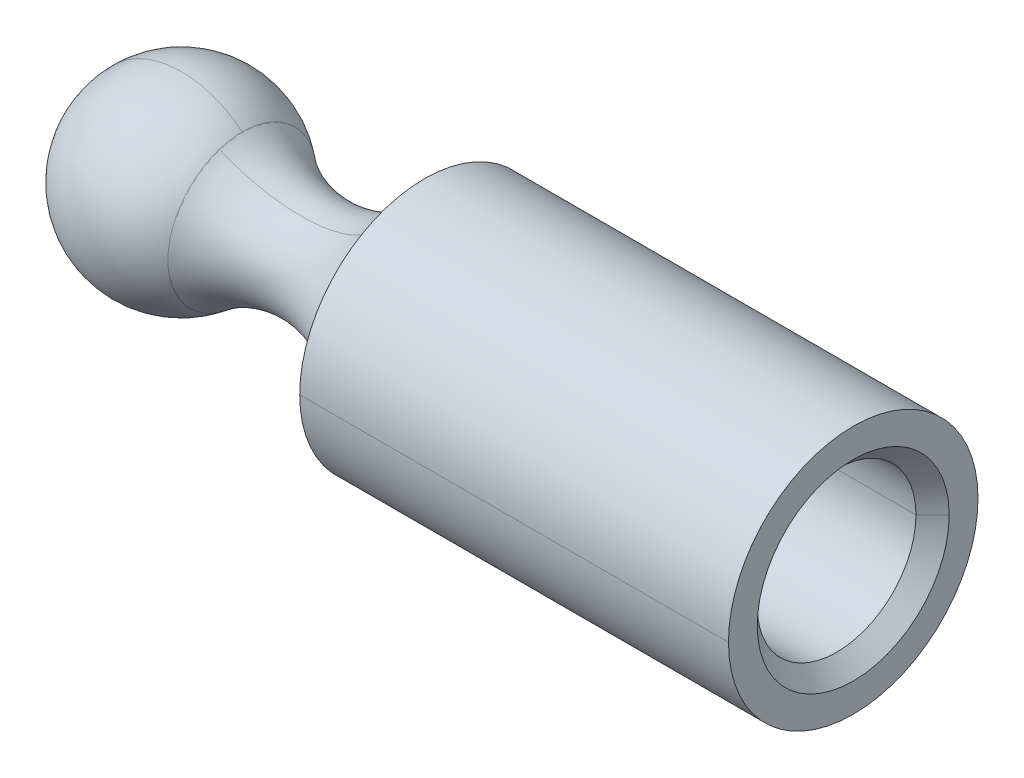
ISO-10303-21;
HEADER;
FILE_DESCRIPTION(('STEP AP214'),'2;1');
FILE_NAME('part.step','',(''),(''),'','','');
FILE_SCHEMA(('AUTOMOTIVE_DESIGN { 1 0 10303 214 1 1 1 1 }'));
ENDSEC;
DATA;
#1=APPLICATION_CONTEXT('core data for automotive mechanical design processes');
#2=APPLICATION_PROTOCOL_DEFINITION('international standard','automotive_design',2000,#1);
#3=PRODUCT_CONTEXT('',#1,'mechanical');
#4=PRODUCT('Part','Part','',(#3));
#5=PRODUCT_RELATED_PRODUCT_CATEGORY('part','',(#4));
#6=PRODUCT_DEFINITION_FORMATION('','',#4);
#7=PRODUCT_DEFINITION_CONTEXT('part definition',#1,'design');
#8=PRODUCT_DEFINITION('design','',#6,#7);
#9=PRODUCT_DEFINITION_SHAPE('','',#8);
#10=(LENGTH_UNIT() NAMED_UNIT(*) SI_UNIT(.MILLI.,.METRE.));
#11=(NAMED_UNIT(*) PLANE_ANGLE_UNIT() SI_UNIT($,.RADIAN.));
#12=(NAMED_UNIT(*) SI_UNIT($,.STERADIAN.) SOLID_ANGLE_UNIT());
#13=UNCERTAINTY_MEASURE_WITH_UNIT(LENGTH_MEASURE(1.E-05),#10,'distance_accuracy_value','');
#14=(GEOMETRIC_REPRESENTATION_CONTEXT(3) GLOBAL_UNCERTAINTY_ASSIGNED_CONTEXT((#13)) GLOBAL_UNIT_ASSIGNED_CONTEXT((#10,
#11,#12)) REPRESENTATION_CONTEXT('',''));
#15=CARTESIAN_POINT('',(0.,0.,0.));
#16=DIRECTION('',(0.,0.,1.));
#17=DIRECTION('',(1.,0.,0.));
#18=AXIS2_PLACEMENT_3D('',#15,#16,#17);
#19=CARTESIAN_POINT('',(-17.5,0.,0.));
#20=DIRECTION('',(1.,0.,0.));
#21=DIRECTION('',(0.,0.,1.));
#22=AXIS2_PLACEMENT_3D('',#19,#20,#21);
#23=SPHERICAL_SURFACE('',#22,2.50000000000007);
#24=CARTESIAN_POINT('',(-17.5,0.,0.));
#25=DIRECTION('',(0.,0.,1.));
#26=DIRECTION('',(0.638971066378369,0.769230769230723,0.));
#27=AXIS2_PLACEMENT_3D('',#24,#25,#26);
#28=CIRCLE('',#27,2.50000000000007);
#29=CARTESIAN_POINT('',(-15.902572334054,1.92307692307686,0.));
#30=VERTEX_POINT('',#29);
#31=CARTESIAN_POINT('',(-20.0000000000001,0.,0.));
#32=VERTEX_POINT('',#31);
#33=EDGE_CURVE('E11',#30,#32,#28,.T.);
#34=ORIENTED_EDGE('',*,*,#33,.F.);
#35=CARTESIAN_POINT('',(-15.902572334054,0.,0.));
#36=DIRECTION('',(1.,0.,0.));
#37=DIRECTION('',(0.,0.,-1.));
#38=AXIS2_PLACEMENT_3D('',#35,#36,#37);
#39=CIRCLE('',#38,1.9230769230769);
#40=CARTESIAN_POINT('',(-15.902572334054,0.,-1.9230769230769));
#41=VERTEX_POINT('',#40);
#42=EDGE_CURVE('E26',#41,#30,#39,.T.);
#43=ORIENTED_EDGE('',*,*,#42,.F.);
#44=CARTESIAN_POINT('',(-15.902572334054,0.,0.));
#45=DIRECTION('',(1.,0.,0.));
#46=DIRECTION('',(0.,-1.,0.));
#47=AXIS2_PLACEMENT_3D('',#44,#45,#46);
#48=CIRCLE('',#47,1.9230769230769);
#49=CARTESIAN_POINT('',(-15.902572334054,-1.92307692307686,0.));
#50=VERTEX_POINT('',#49);
#51=EDGE_CURVE('E339',#50,#41,#48,.T.);
#52=ORIENTED_EDGE('',*,*,#51,.F.);
#53=CARTESIAN_POINT('',(-17.5,0.,0.));
#54=DIRECTION('',(0.,0.,-1.));
#55=DIRECTION('',(0.638971066378369,-0.769230769230723,0.));
#56=AXIS2_PLACEMENT_3D('',#53,#54,#55);
#57=CIRCLE('',#56,2.50000000000007);
#58=EDGE_CURVE('E322',#50,#32,#57,.T.);
#59=ORIENTED_EDGE('',*,*,#58,.T.);
#60=EDGE_LOOP('',(#34,#43,#52,#59));
#61=FACE_BOUND('',#60,.T.);
#62=ADVANCED_FACE('F17',(#61),#23,.T.);
#63=CARTESIAN_POINT('',(-17.5,0.,0.));
#64=DIRECTION('',(1.,0.,0.));
#65=DIRECTION('',(0.,0.,-1.));
#66=AXIS2_PLACEMENT_3D('',#63,#64,#65);
#67=SPHERICAL_SURFACE('',#66,2.50000000000007);
#68=ORIENTED_EDGE('',*,*,#58,.F.);
#69=CARTESIAN_POINT('',(-15.902572334054,0.,0.));
#70=DIRECTION('',(1.,0.,0.));
#71=DIRECTION('',(0.,0.,-1.));
#72=AXIS2_PLACEMENT_3D('',#69,#70,#71);
#73=CIRCLE('',#72,1.9230769230769);
#74=CARTESIAN_POINT('',(-15.902572334054,0.,1.9230769230769));
#75=VERTEX_POINT('',#74);
#76=EDGE_CURVE('E321',#75,#50,#73,.T.);
#77=ORIENTED_EDGE('',*,*,#76,.F.);
#78=CARTESIAN_POINT('',(-15.902572334054,0.,0.));
#79=DIRECTION('',(1.,0.,0.));
#80=DIRECTION('',(0.,1.,0.));
#81=AXIS2_PLACEMENT_3D('',#78,#79,#80);
#82=CIRCLE('',#81,1.9230769230769);
#83=EDGE_CURVE('E317',#30,#75,#82,.T.);
#84=ORIENTED_EDGE('',*,*,#83,.F.);
#85=ORIENTED_EDGE('',*,*,#33,.T.);
#86=EDGE_LOOP('',(#68,#77,#84,#85));
#87=FACE_BOUND('',#86,.T.);
#88=ADVANCED_FACE('F283',(#87),#67,.T.);
#89=CARTESIAN_POINT('',(-15.902572334054,0.,0.));
#90=DIRECTION('',(-1.,0.,0.));
#91=DIRECTION('',(0.,-1.,0.));
#92=AXIS2_PLACEMENT_3D('',#89,#90,#91);
#93=CONICAL_SURFACE('',#92,1.9230769230769,0.693159907569802);
#94=DIRECTION('',(-0.769230769235187,0.,-0.638971066372995));
#95=VECTOR('',#94,1.);
#96=CARTESIAN_POINT('',(-15.902572334054,0.,-1.9230769230769));
#97=LINE('',#96,#95);
#98=CARTESIAN_POINT('',(-15.916913199135,0.,-1.9349893402864));
#99=VERTEX_POINT('',#98);
#100=EDGE_CURVE('E306',#41,#99,#97,.T.);
#101=ORIENTED_EDGE('',*,*,#100,.F.);
#102=ORIENTED_EDGE('',*,*,#42,.T.);
#103=ORIENTED_EDGE('',*,*,#83,.T.);
#104=DIRECTION('',(-0.769230769235187,0.,0.638971066372995));
#105=VECTOR('',#104,1.);
#106=CARTESIAN_POINT('',(-15.902572334054,0.,1.9230769230769));
#107=LINE('',#106,#105);
#108=CARTESIAN_POINT('',(-15.916913199135,0.,1.9349893402864));
#109=VERTEX_POINT('',#108);
#110=EDGE_CURVE('E191',#75,#109,#107,.T.);
#111=ORIENTED_EDGE('',*,*,#110,.T.);
#112=CARTESIAN_POINT('',(-15.916913199135,1.84028422104102,0.597944590082857));
#113=CARTESIAN_POINT('',(-15.916913199135,1.83245740316423,0.622033949215891));
#114=CARTESIAN_POINT('',(-15.916913199135,1.82415708534155,0.645969439197646));
#115=CARTESIAN_POINT('',(-15.916913199135,1.80662338297653,0.693496192674832));
#116=CARTESIAN_POINT('',(-15.916913199135,1.79738999843419,0.717087456170262));
#117=CARTESIAN_POINT('',(-15.916913199135,1.778004095802,0.763889268491037));
#118=CARTESIAN_POINT('',(-15.916913199135,1.76785157771215,0.78709981731638));
#119=CARTESIAN_POINT('',(-15.916913199135,1.74664314389858,0.833104441367647));
#120=CARTESIAN_POINT('',(-15.916913199135,1.73558722817487,0.855898516593572));
#121=CARTESIAN_POINT('',(-15.916913199135,1.71258902468535,0.90103503858104));
#122=CARTESIAN_POINT('',(-15.916913199135,1.70064673691954,0.923377485342582));
#123=CARTESIAN_POINT('',(-15.916913199135,1.67589420933703,0.967576302125619));
#124=CARTESIAN_POINT('',(-15.916913199135,1.66308396952033,0.989432672147112));
#125=CARTESIAN_POINT('',(-15.916913199135,1.63661528873006,1.03262563393347));
#126=CARTESIAN_POINT('',(-15.916913199135,1.62295684775649,1.05396222569833));
#127=CARTESIAN_POINT('',(-15.916913199135,1.59481282539845,1.09608273164836));
#128=CARTESIAN_POINT('',(-15.916913199135,1.58032724401397,1.11686664583352));
#129=CARTESIAN_POINT('',(-15.916913199135,1.55055127643812,1.15784974929342));
#130=CARTESIAN_POINT('',(-15.916913199135,1.53526089024676,1.17804893856815));
#131=CARTESIAN_POINT('',(-15.916913199135,1.50389888975455,1.21783144653249));
#132=CARTESIAN_POINT('',(-15.916913199135,1.48782727545369,1.23741476522211));
#133=CARTESIAN_POINT('',(-15.916913199135,1.45492759999877,1.27593533595527));
#134=CARTESIAN_POINT('',(-15.916913199135,1.4380995388447,1.29487258799881));
#135=CARTESIAN_POINT('',(-15.916913199135,1.40371291733609,1.33207182557056));
#136=CARTESIAN_POINT('',(-15.916913199135,1.38615435698155,1.35033381109876));
#137=CARTESIAN_POINT('',(-15.916913199135,1.35033381109881,1.38615435698159));
#138=CARTESIAN_POINT('',(-15.916913199135,1.33207182557062,1.40371291733622));
#139=CARTESIAN_POINT('',(-15.916913199135,1.29487258799876,1.43809953884456));
#140=CARTESIAN_POINT('',(-15.916913199135,1.27593533595509,1.45492759999827));
#141=CARTESIAN_POINT('',(-15.916913199135,1.2374147652223,1.48782727545418));
#142=CARTESIAN_POINT('',(-15.916913199135,1.21783144653318,1.50389888975638));
#143=CARTESIAN_POINT('',(-15.916913199135,1.17804893856747,1.53526089024492));
#144=CARTESIAN_POINT('',(-15.916913199135,1.15784974929089,1.55055127643125));
#145=CARTESIAN_POINT('',(-15.916913199135,1.11686664583606,1.58032724402083));
#146=CARTESIAN_POINT('',(-15.916913199135,1.09608273165782,1.59481282542407));
#147=CARTESIAN_POINT('',(-15.916913199135,1.05396222568888,1.62295684773087));
#148=CARTESIAN_POINT('',(-15.916913199135,1.03262563389819,1.63661528863442));
#149=CARTESIAN_POINT('',(-15.916913199135,0.989432672182397,1.66308396961595));
#150=CARTESIAN_POINT('',(-15.916913199135,0.967576302257293,1.67589420969393));
#151=CARTESIAN_POINT('',(-15.916913199135,0.923377485210917,1.70064673656264));
#152=CARTESIAN_POINT('',(-15.916913199135,0.901035038089645,1.71258902335338));
#153=CARTESIAN_POINT('',(-15.916913199135,0.855898517084975,1.73558722950682));
#154=CARTESIAN_POINT('',(-15.916913199135,0.833104443201577,1.74664314886953));
#155=CARTESIAN_POINT('',(-15.916913199135,0.787099815482459,1.7678515727412));
#156=CARTESIAN_POINT('',(-15.916913199135,0.76388926164674,1.77800407725018));
#157=CARTESIAN_POINT('',(-15.916913199135,0.717087463014569,1.79739001698601));
#158=CARTESIAN_POINT('',(-15.916913199135,0.693496218218118,1.80662345221287));
#159=CARTESIAN_POINT('',(-15.916913199135,0.64596941365437,1.8241570161052));
#160=CARTESIAN_POINT('',(-15.916913199135,0.622033853887073,1.83245714477068));
#161=CARTESIAN_POINT('',(-15.916913199135,0.573855326278651,1.84811129731135));
#162=CARTESIAN_POINT('',(-15.916913199135,0.549612358437525,1.85546532118653));
#163=CARTESIAN_POINT('',(-15.916913199135,0.500856395585398,1.86921592489468));
#164=CARTESIAN_POINT('',(-15.916913199135,0.476343400574396,1.87561250472764));
#165=CARTESIAN_POINT('',(-15.916913199135,0.427085180626515,1.88743835684159));
#166=CARTESIAN_POINT('',(-15.916913199135,0.402339955689636,1.89286762912258));
#167=CARTESIAN_POINT('',(-15.916913199135,0.352655431298864,1.90275049625748));
#168=CARTESIAN_POINT('',(-15.916913199135,0.327716131844971,1.90720409111139));
#169=CARTESIAN_POINT('',(-15.916913199135,0.277681912767536,1.91512873004207));
#170=CARTESIAN_POINT('',(-15.916913199135,0.252586993143992,1.91859977411885));
#171=CARTESIAN_POINT('',(-15.916913199135,0.202280229187856,1.92455398264599));
#172=CARTESIAN_POINT('',(-15.916913199135,0.177068384855263,1.92703714709635));
#173=CARTESIAN_POINT('',(-15.916913199135,0.126566642908524,1.93101168074429));
#174=CARTESIAN_POINT('',(-15.916913199135,0.101276745294377,1.93250304994187));
#175=CARTESIAN_POINT('',(-15.916913199135,0.0506579046964438,1.93449201731898));
#176=CARTESIAN_POINT('',(-15.916913199135,0.0253289617126568,1.93498961549851));
#177=CARTESIAN_POINT('',(-15.916913199135,0.,1.93498934028637));
#178=B_SPLINE_CURVE_WITH_KNOTS('',3,(#112,#113,#114,#115,#116,#117,#118,#119,#120,#121,#122,
#123,#124,#125,#126,#127,#128,#129,#130,#131,#132,#133,#134,#135,#136,#137,#138,#139,#140,#141,
#142,#143,#144,#145,#146,#147,#148,#149,#150,#151,#152,#153,#154,#155,#156,#157,#158,#159,#160,
#161,#162,#163,#164,#165,#166,#167,#168,#169,#170,#171,#172,#173,#174,#175,#176,#177),
.UNSPECIFIED.,.F.,.F.,(4,2,2,2,2,2,2,2,2,2,2,2,2,2,2,2,2,2,2,2,2,2,2,2,2,2,2,2,2,2,2,2,4),(0.,
0.075981971243553,0.151963942487106,0.22794591373066,0.303927884974213,0.379909856217766,
0.45589182746132,0.531873798704872,0.607855769948426,0.683837741191979,0.759819712435532,
0.835801683679085,0.911783654922639,0.987765626166192,1.06374759740975,1.1397295686533,
1.21571153989685,1.2916935111404,1.36767548238396,1.44365745362751,1.51963942487107,
1.59562139611462,1.67160336735817,1.74758533860172,1.82356730984528,1.89954928108883,
1.97553125233238,2.05151322357594,2.12749519481949,2.20347716606304,2.2794591373066,
2.35544110855015,2.4314230797937),.UNSPECIFIED.);
#179=CARTESIAN_POINT('',(-15.916913199135,1.84028422104102,0.597944590082857));
#180=VERTEX_POINT('',#179);
#181=EDGE_CURVE('E199',#180,#109,#178,.T.);
#182=ORIENTED_EDGE('',*,*,#181,.F.);
#183=CARTESIAN_POINT('',(-15.916913199135,0.,0.));
#184=DIRECTION('',(1.,0.,0.));
#185=DIRECTION('',(0.,0.,-1.));
#186=AXIS2_PLACEMENT_3D('',#183,#184,#185);
#187=CIRCLE('',#186,1.9349893402864);
#188=EDGE_CURVE('E206',#99,#180,#187,.T.);
#189=ORIENTED_EDGE('',*,*,#188,.F.);
#190=EDGE_LOOP('',(#101,#102,#103,#111,#182,#189));
#191=FACE_BOUND('',#190,.T.);
#192=ADVANCED_FACE('F278',(#191),#93,.F.);
#193=CARTESIAN_POINT('',(-14.,0.,0.));
#194=DIRECTION('',(1.,0.,0.));
#195=DIRECTION('',(0.,-0.309016994374947,0.951056516295154));
#196=AXIS2_PLACEMENT_3D('',#193,#194,#195);
#197=TOROIDAL_SURFACE('',#196,4.24268164797894,3.00000000000025);
#198=CARTESIAN_POINT('',(-14.,-4.03503002787623,-1.3110607309482));
#199=DIRECTION('',(0.,0.309016994374947,-0.951056516295154));
#200=DIRECTION('',(-0.638971066378286,0.731581935611678,0.237705380288428));
#201=AXIS2_PLACEMENT_3D('',#198,#199,#200);
#202=CIRCLE('',#201,3.00000000000025);
#203=CARTESIAN_POINT('',(-15.916913199135,-1.84028422104101,-0.597944590082857));
#204=VERTEX_POINT('',#203);
#205=CARTESIAN_POINT('',(-11.168996088705,-3.09093367795927,-1.00430523171858));
#206=VERTEX_POINT('',#205);
#207=EDGE_CURVE('E524',#204,#206,#202,.T.);
#208=ORIENTED_EDGE('',*,*,#207,.F.);
#209=CARTESIAN_POINT('',(-15.916913199135,-1.84028422104101,-0.597944590082856));
#210=CARTESIAN_POINT('',(-15.916913199135,-1.83245740316423,-0.62203394921589));
#211=CARTESIAN_POINT('',(-15.916913199135,-1.82415708534155,-0.645969439197645));
#212=CARTESIAN_POINT('',(-15.916913199135,-1.80662338297653,-0.69349619267483));
#213=CARTESIAN_POINT('',(-15.916913199135,-1.79738999843419,-0.717087456170261));
#214=CARTESIAN_POINT('',(-15.916913199135,-1.778004095802,-0.763889268491035));
#215=CARTESIAN_POINT('',(-15.916913199135,-1.76785157771215,-0.787099817316378));
#216=CARTESIAN_POINT('',(-15.916913199135,-1.74664314389858,-0.833104441367646));
#217=CARTESIAN_POINT('',(-15.916913199135,-1.73558722817486,-0.85589851659357));
#218=CARTESIAN_POINT('',(-15.916913199135,-1.71258902468534,-0.901035038581038));
#219=CARTESIAN_POINT('',(-15.916913199135,-1.70064673691954,-0.923377485342581));
#220=CARTESIAN_POINT('',(-15.916913199135,-1.67589420933703,-0.967576302125617));
#221=CARTESIAN_POINT('',(-15.916913199135,-1.66308396952032,-0.98943267214711));
#222=CARTESIAN_POINT('',(-15.916913199135,-1.63661528873005,-1.03262563393347));
#223=CARTESIAN_POINT('',(-15.916913199135,-1.62295684775649,-1.05396222569833));
#224=CARTESIAN_POINT('',(-15.916913199135,-1.59481282539845,-1.09608273164836));
#225=CARTESIAN_POINT('',(-15.916913199135,-1.58032724401396,-1.11686664583352));
#226=CARTESIAN_POINT('',(-15.916913199135,-1.55055127643812,-1.15784974929342));
#227=CARTESIAN_POINT('',(-15.916913199135,-1.53526089024676,-1.17804893856814));
#228=CARTESIAN_POINT('',(-15.916913199135,-1.50389888975454,-1.21783144653249));
#229=CARTESIAN_POINT('',(-15.916913199135,-1.48782727545369,-1.23741476522211));
#230=CARTESIAN_POINT('',(-15.916913199135,-1.45492759999876,-1.27593533595527));
#231=CARTESIAN_POINT('',(-15.916913199135,-1.4380995388447,-1.29487258799881));
#232=CARTESIAN_POINT('',(-15.916913199135,-1.40371291733609,-1.33207182557055));
#233=CARTESIAN_POINT('',(-15.916913199135,-1.38615435698155,-1.35033381109876));
#234=CARTESIAN_POINT('',(-15.916913199135,-1.35033381109881,-1.38615435698159));
#235=CARTESIAN_POINT('',(-15.916913199135,-1.33207182557062,-1.40371291733622));
#236=CARTESIAN_POINT('',(-15.916913199135,-1.29487258799876,-1.43809953884456));
#237=CARTESIAN_POINT('',(-15.916913199135,-1.27593533595509,-1.45492759999827));
#238=CARTESIAN_POINT('',(-15.916913199135,-1.2374147652223,-1.48782727545418));
#239=CARTESIAN_POINT('',(-15.916913199135,-1.21783144653318,-1.50389888975638));
#240=CARTESIAN_POINT('',(-15.916913199135,-1.17804893856747,-1.53526089024492));
#241=CARTESIAN_POINT('',(-15.916913199135,-1.15784974929089,-1.55055127643125));
#242=CARTESIAN_POINT('',(-15.916913199135,-1.11686664583606,-1.58032724402083));
#243=CARTESIAN_POINT('',(-15.916913199135,-1.09608273165782,-1.59481282542407));
#244=CARTESIAN_POINT('',(-15.916913199135,-1.05396222568888,-1.62295684773086));
#245=CARTESIAN_POINT('',(-15.916913199135,-1.03262563389819,-1.63661528863442));
#246=CARTESIAN_POINT('',(-15.916913199135,-0.989432672182396,-1.66308396961595));
#247=CARTESIAN_POINT('',(-15.916913199135,-0.967576302257292,-1.67589420969393));
#248=CARTESIAN_POINT('',(-15.916913199135,-0.923377485210916,-1.70064673656264));
#249=CARTESIAN_POINT('',(-15.916913199135,-0.901035038089644,-1.71258902335338));
#250=CARTESIAN_POINT('',(-15.916913199135,-0.855898517084975,-1.73558722950682));
#251=CARTESIAN_POINT('',(-15.916913199135,-0.833104443201577,-1.74664314886952));
#252=CARTESIAN_POINT('',(-15.916913199135,-0.787099815482459,-1.7678515727412));
#253=CARTESIAN_POINT('',(-15.916913199135,-0.763889261646739,-1.77800407725018));
#254=CARTESIAN_POINT('',(-15.916913199135,-0.717087463014568,-1.79739001698601));
#255=CARTESIAN_POINT('',(-15.916913199135,-0.693496218218117,-1.80662345221287));
#256=CARTESIAN_POINT('',(-15.916913199135,-0.64596941365437,-1.8241570161052));
#257=CARTESIAN_POINT('',(-15.916913199135,-0.622033853887073,-1.83245714477068));
#258=CARTESIAN_POINT('',(-15.916913199135,-0.573855326278651,-1.84811129731134));
#259=CARTESIAN_POINT('',(-15.916913199135,-0.549612358437524,-1.85546532118653));
#260=CARTESIAN_POINT('',(-15.916913199135,-0.500856395585398,-1.86921592489468));
#261=CARTESIAN_POINT('',(-15.916913199135,-0.476343400574397,-1.87561250472763));
#262=CARTESIAN_POINT('',(-15.916913199135,-0.427085180626516,-1.88743835684158));
#263=CARTESIAN_POINT('',(-15.916913199135,-0.402339955689636,-1.89286762912258));
#264=CARTESIAN_POINT('',(-15.916913199135,-0.352655431298863,-1.90275049625748));
#265=CARTESIAN_POINT('',(-15.916913199135,-0.327716131844971,-1.90720409111138));
#266=CARTESIAN_POINT('',(-15.916913199135,-0.277681912767536,-1.91512873004207));
#267=CARTESIAN_POINT('',(-15.916913199135,-0.252586993143993,-1.91859977411885));
#268=CARTESIAN_POINT('',(-15.916913199135,-0.202280229187857,-1.92455398264598));
#269=CARTESIAN_POINT('',(-15.916913199135,-0.177068384855264,-1.92703714709634));
#270=CARTESIAN_POINT('',(-15.916913199135,-0.126566642908525,-1.93101168074428));
#271=CARTESIAN_POINT('',(-15.916913199135,-0.101276745294378,-1.93250304994187));
#272=CARTESIAN_POINT('',(-15.916913199135,-0.0506579046964448,-1.93449201731898));
#273=CARTESIAN_POINT('',(-15.916913199135,-0.0253289617126578,-1.93498961549851));
#274=CARTESIAN_POINT('',(-15.916913199135,0.,-1.93498934028637));
#275=B_SPLINE_CURVE_WITH_KNOTS('',3,(#209,#210,#211,#212,#213,#214,#215,#216,#217,#218,#219,
#220,#221,#222,#223,#224,#225,#226,#227,#228,#229,#230,#231,#232,#233,#234,#235,#236,#237,#238,
#239,#240,#241,#242,#243,#244,#245,#246,#247,#248,#249,#250,#251,#252,#253,#254,#255,#256,#257,
#258,#259,#260,#261,#262,#263,#264,#265,#266,#267,#268,#269,#270,#271,#272,#273,#274),
.UNSPECIFIED.,.F.,.F.,(4,2,2,2,2,2,2,2,2,2,2,2,2,2,2,2,2,2,2,2,2,2,2,2,2,2,2,2,2,2,2,2,4),(0.,
0.075981971243553,0.151963942487106,0.227945913730659,0.303927884974212,0.379909856217765,
0.455891827461319,0.531873798704872,0.607855769948425,0.683837741191977,0.75981971243553,
0.835801683679084,0.911783654922637,0.98776562616619,1.06374759740974,1.1397295686533,
1.21571153989685,1.2916935111404,1.36767548238395,1.44365745362751,1.51963942487106,
1.59562139611461,1.67160336735817,1.74758533860172,1.82356730984527,1.89954928108883,
1.97553125233238,2.05151322357593,2.12749519481949,2.20347716606304,2.27945913730659,
2.35544110855014,2.4314230797937),.UNSPECIFIED.);
#276=EDGE_CURVE('E193',#204,#99,#275,.T.);
#277=ORIENTED_EDGE('',*,*,#276,.T.);
#278=ORIENTED_EDGE('',*,*,#188,.T.);
#279=CARTESIAN_POINT('',(-14.,4.03503002787623,1.3110607309482));
#280=DIRECTION('',(0.,-0.309016994374947,0.951056516295154));
#281=DIRECTION('',(-0.638971066378287,-0.731581935611678,-0.237705380288428));
#282=AXIS2_PLACEMENT_3D('',#279,#280,#281);
#283=CIRCLE('',#282,3.00000000000025);
#284=CARTESIAN_POINT('',(-11.168996088705,3.09093367795926,1.00430523171858));
#285=VERTEX_POINT('',#284);
#286=EDGE_CURVE('E202',#180,#285,#283,.T.);
#287=ORIENTED_EDGE('',*,*,#286,.T.);
#288=CARTESIAN_POINT('',(-11.168996088705,0.,0.));
#289=DIRECTION('',(1.,0.,0.));
#290=DIRECTION('',(0.,0.,-1.));
#291=AXIS2_PLACEMENT_3D('',#288,#289,#290);
#292=CIRCLE('',#291,3.25);
#293=CARTESIAN_POINT('',(-11.168996088705,0.,-3.25));
#294=VERTEX_POINT('',#293);
#295=EDGE_CURVE('E252',#294,#285,#292,.T.);
#296=ORIENTED_EDGE('',*,*,#295,.F.);
#297=CARTESIAN_POINT('',(-11.168996088705,0.,0.));
#298=DIRECTION('',(1.,0.,0.));
#299=DIRECTION('',(0.,0.,-1.));
#300=AXIS2_PLACEMENT_3D('',#297,#298,#299);
#301=CIRCLE('',#300,3.25);
#302=EDGE_CURVE('E247',#206,#294,#301,.T.);
#303=ORIENTED_EDGE('',*,*,#302,.F.);
#304=EDGE_LOOP('',(#208,#277,#278,#287,#296,#303));
#305=FACE_BOUND('',#304,.T.);
#306=ADVANCED_FACE('F267',(#305),#197,.F.);
#307=CARTESIAN_POINT('',(0.,0.,0.));
#308=DIRECTION('',(1.,0.,0.));
#309=DIRECTION('',(0.,1.,0.));
#310=AXIS2_PLACEMENT_3D('',#307,#308,#309);
#311=CYLINDRICAL_SURFACE('',#310,3.25);
#312=DIRECTION('',(1.,0.,0.));
#313=VECTOR('',#312,1.);
#314=CARTESIAN_POINT('',(-11.168996088705,0.,3.25));
#315=LINE('',#314,#313);
#316=CARTESIAN_POINT('',(-11.168996088705,0.,3.25));
#317=VERTEX_POINT('',#316);
#318=CARTESIAN_POINT('',(0.,0.,3.25));
#319=VERTEX_POINT('',#318);
#320=EDGE_CURVE('E242',#317,#319,#315,.T.);
#321=ORIENTED_EDGE('',*,*,#320,.F.);
#322=CARTESIAN_POINT('',(-11.168996088705,0.,0.));
#323=DIRECTION('',(1.,0.,0.));
#324=DIRECTION('',(0.,0.,-1.));
#325=AXIS2_PLACEMENT_3D('',#322,#323,#324);
#326=CIRCLE('',#325,3.25);
#327=EDGE_CURVE('E237',#317,#206,#326,.T.);
#328=ORIENTED_EDGE('',*,*,#327,.T.);
#329=ORIENTED_EDGE('',*,*,#302,.T.);
#330=DIRECTION('',(1.,0.,0.));
#331=VECTOR('',#330,1.);
#332=CARTESIAN_POINT('',(-11.168996088705,0.,-3.25));
#333=LINE('',#332,#331);
#334=CARTESIAN_POINT('',(0.,0.,-3.25));
#335=VERTEX_POINT('',#334);
#336=EDGE_CURVE('E233',#294,#335,#333,.T.);
#337=ORIENTED_EDGE('',*,*,#336,.T.);
#338=CARTESIAN_POINT('',(0.,0.,0.));
#339=DIRECTION('',(1.,0.,0.));
#340=DIRECTION('',(0.,0.,-1.));
#341=AXIS2_PLACEMENT_3D('',#338,#339,#340);
#342=CIRCLE('',#341,3.25);
#343=EDGE_CURVE('E228',#319,#335,#342,.T.);
#344=ORIENTED_EDGE('',*,*,#343,.F.);
#345=EDGE_LOOP('',(#321,#328,#329,#337,#344));
#346=FACE_BOUND('',#345,.T.);
#347=ADVANCED_FACE('F277',(#346),#311,.T.);
#348=CARTESIAN_POINT('',(0.,3.25,0.));
#349=DIRECTION('',(-1.,0.,0.));
#350=DIRECTION('',(0.,0.,1.));
#351=AXIS2_PLACEMENT_3D('',#348,#349,#350);
#352=PLANE('',#351);
#353=CARTESIAN_POINT('',(0.,0.,0.));
#354=DIRECTION('',(1.,0.,0.));
#355=DIRECTION('',(0.,0.,-1.));
#356=AXIS2_PLACEMENT_3D('',#353,#354,#355);
#357=CIRCLE('',#356,2.5);
#358=CARTESIAN_POINT('',(0.,0.,2.5));
#359=VERTEX_POINT('',#358);
#360=CARTESIAN_POINT('',(0.,0.,-2.5));
#361=VERTEX_POINT('',#360);
#362=EDGE_CURVE('E223',#359,#361,#357,.T.);
#363=ORIENTED_EDGE('',*,*,#362,.F.);
#364=CARTESIAN_POINT('',(0.,0.,0.));
#365=DIRECTION('',(1.,0.,0.));
#366=DIRECTION('',(0.,0.,-1.));
#367=AXIS2_PLACEMENT_3D('',#364,#365,#366);
#368=CIRCLE('',#367,2.5);
#369=EDGE_CURVE('E218',#361,#359,#368,.T.);
#370=ORIENTED_EDGE('',*,*,#369,.F.);
#371=EDGE_LOOP('',(#363,#370));
#372=FACE_BOUND('',#371,.T.);
#373=CARTESIAN_POINT('',(0.,0.,0.));
#374=DIRECTION('',(1.,0.,0.));
#375=DIRECTION('',(0.,0.,-1.));
#376=AXIS2_PLACEMENT_3D('',#373,#374,#375);
#377=CIRCLE('',#376,3.25);
#378=EDGE_CURVE('E213',#335,#319,#377,.T.);
#379=ORIENTED_EDGE('',*,*,#378,.T.);
#380=ORIENTED_EDGE('',*,*,#343,.T.);
#381=EDGE_LOOP('',(#379,#380));
#382=FACE_BOUND('',#381,.T.);
#383=ADVANCED_FACE('F400',(#372,#382),#352,.F.);
#384=CARTESIAN_POINT('',(0.,0.,0.));
#385=DIRECTION('',(1.,0.,0.));
#386=DIRECTION('',(0.,-1.,0.));
#387=AXIS2_PLACEMENT_3D('',#384,#385,#386);
#388=CYLINDRICAL_SURFACE('',#387,3.25);
#389=ORIENTED_EDGE('',*,*,#320,.T.);
#390=ORIENTED_EDGE('',*,*,#378,.F.);
#391=ORIENTED_EDGE('',*,*,#336,.F.);
#392=ORIENTED_EDGE('',*,*,#295,.T.);
#393=CARTESIAN_POINT('',(-11.168996088705,0.,0.));
#394=DIRECTION('',(1.,0.,0.));
#395=DIRECTION('',(0.,0.,-1.));
#396=AXIS2_PLACEMENT_3D('',#393,#394,#395);
#397=CIRCLE('',#396,3.25);
#398=EDGE_CURVE('E197',#285,#317,#397,.T.);
#399=ORIENTED_EDGE('',*,*,#398,.T.);
#400=EDGE_LOOP('',(#389,#390,#391,#392,#399));
#401=FACE_BOUND('',#400,.T.);
#402=ADVANCED_FACE('F410',(#401),#388,.T.);
#403=CARTESIAN_POINT('',(-14.,0.,0.));
#404=DIRECTION('',(1.,0.,0.));
#405=DIRECTION('',(0.,0.309016994374947,-0.951056516295154));
#406=AXIS2_PLACEMENT_3D('',#403,#404,#405);
#407=TOROIDAL_SURFACE('',#406,4.24268164797894,3.00000000000025);
#408=ORIENTED_EDGE('',*,*,#207,.T.);
#409=ORIENTED_EDGE('',*,*,#327,.F.);
#410=ORIENTED_EDGE('',*,*,#398,.F.);
#411=ORIENTED_EDGE('',*,*,#286,.F.);
#412=ORIENTED_EDGE('',*,*,#181,.T.);
#413=CARTESIAN_POINT('',(-15.916913199135,0.,1.93498934028637));
#414=CARTESIAN_POINT('',(-15.916913199135,-0.0379935063948019,1.93499073220446));
#415=CARTESIAN_POINT('',(-15.916913199135,-0.0759868706129993,1.93387039086776));
#416=CARTESIAN_POINT('',(-15.916913199135,-0.151841884425272,1.92939623809603));
#417=CARTESIAN_POINT('',(-15.916913199135,-0.189703534019347,1.926042426661));
#418=CARTESIAN_POINT('',(-15.916913199135,-0.265163688312476,1.91711133010384));
#419=CARTESIAN_POINT('',(-15.916913199135,-0.30276219301153,1.91153404498171));
#420=CARTESIAN_POINT('',(-15.916913199135,-0.377565662458408,1.89817578611557));
#421=CARTESIAN_POINT('',(-15.916913199135,-0.414770627206232,1.89039481237156));
#422=CARTESIAN_POINT('',(-15.916913199135,-0.488657953994657,1.87265604919767));
#423=CARTESIAN_POINT('',(-15.916913199135,-0.525340316035257,1.86269825976779));
#424=CARTESIAN_POINT('',(-15.916913199135,-0.598055196236442,1.84064043809599));
#425=CARTESIAN_POINT('',(-15.916913199135,-0.634087714397026,1.82854040585406));
#426=CARTESIAN_POINT('',(-15.916913199135,-0.705377917475441,1.80224006246402));
#427=CARTESIAN_POINT('',(-15.916913199135,-0.740635602393273,1.78803975131591));
#428=CARTESIAN_POINT('',(-15.916913199135,-0.810253837980278,1.75758811012491));
#429=CARTESIAN_POINT('',(-15.916913199135,-0.844614388649452,1.74133678008203));
#430=CARTESIAN_POINT('',(-15.916913199135,-0.912319166525151,1.70683947277819));
#431=CARTESIAN_POINT('',(-15.916913199135,-0.945663393731677,1.68859349551723));
#432=CARTESIAN_POINT('',(-15.916913199135,-1.01121986091553,1.65017018521385));
#433=CARTESIAN_POINT('',(-15.916913199135,-1.04343210089285,1.62999285217144));
#434=CARTESIAN_POINT('',(-15.916913199135,-1.10661285645384,1.5877768209835));
#435=CARTESIAN_POINT('',(-15.916913199135,-1.1375813720375,1.56573812283799));
#436=CARTESIAN_POINT('',(-15.916913199135,-1.19816725585581,1.51987580884272));
#437=CARTESIAN_POINT('',(-15.916913199135,-1.22778462409046,1.49605219299297));
#438=CARTESIAN_POINT('',(-15.916913199135,-1.28556547708692,1.44670268245949));
#439=CARTESIAN_POINT('',(-15.916913199135,-1.31372896184872,1.42117678777577));
#440=CARTESIAN_POINT('',(-15.916913199135,-1.36850435497727,1.36851126327872));
#441=CARTESIAN_POINT('',(-15.916913199135,-1.39511626334402,1.34137163346539));
#442=CARTESIAN_POINT('',(-15.916913199135,-1.44669619283676,1.28557278010399));
#443=CARTESIAN_POINT('',(-15.916913199135,-1.47166421396275,1.25691355655591));
#444=CARTESIAN_POINT('',(-15.916913199135,-1.5198697604109,1.19817492825593));
#445=CARTESIAN_POINT('',(-15.916913199135,-1.54310728573306,1.16809552350404));
#446=CARTESIAN_POINT('',(-15.916913199135,-1.58777123471902,1.10662087162291));
#447=CARTESIAN_POINT('',(-15.916913199135,-1.60919765838283,1.07522562449368));
#448=CARTESIAN_POINT('',(-15.916913199135,-1.65016508051015,1.01122819105164));
#449=CARTESIAN_POINT('',(-15.916913199135,-1.66970607897366,0.978626004738816));
#450=CARTESIAN_POINT('',(-15.916913199135,-1.7068348672829,0.912327782729391));
#451=CARTESIAN_POINT('',(-15.916913199135,-1.72442265712863,0.878631747032787));
#452=CARTESIAN_POINT('',(-15.916913199135,-1.75758402003537,0.810262710377992));
#453=CARTESIAN_POINT('',(-15.916913199135,-1.77315759309637,0.775589709419802));
#454=CARTESIAN_POINT('',(-15.916913199135,-1.80223650113982,0.705387015241502));
#455=CARTESIAN_POINT('',(-15.916913199135,-1.81574183612227,0.669857322021392));
#456=CARTESIAN_POINT('',(-15.916913199135,-1.84063742098076,0.598064487994585));
#457=CARTESIAN_POINT('',(-15.916913199135,-1.8520276708568,0.561801347187888));
#458=CARTESIAN_POINT('',(-15.916913199135,-1.87265357522441,0.488667406835027));
#459=CARTESIAN_POINT('',(-15.916913199135,-1.88188922971598,0.451796607288862));
#460=CARTESIAN_POINT('',(-15.916913199135,-1.89817390690664,0.377575246124489));
#461=CARTESIAN_POINT('',(-15.916913199135,-1.90522292960573,0.340224684506281));
#462=CARTESIAN_POINT('',(-15.916913199135,-1.91710989154772,0.265173360106218));
#463=CARTESIAN_POINT('',(-15.916913199135,-1.92194783079061,0.227472597324364));
#464=CARTESIAN_POINT('',(-15.916913199135,-1.9293958446624,0.151851646081746));
#465=CARTESIAN_POINT('',(-15.916913199135,-1.93200591929131,0.113931457620982));
#466=CARTESIAN_POINT('',(-15.916913199135,-1.93498914796954,0.0380031923698315));
#467=CARTESIAN_POINT('',(-15.916913199135,-1.93536230201886,-4.88442055579546E-06));
#468=CARTESIAN_POINT('',(-15.916913199135,-1.933870403329,-0.0759770868229936));
#469=CARTESIAN_POINT('',(-15.916913199135,-1.93200535058982,-0.113941212435044));
#470=CARTESIAN_POINT('',(-15.916913199135,-1.92604347725081,-0.189693815328728));
#471=CARTESIAN_POINT('',(-15.916913199135,-1.92194665665097,-0.227482292610362));
#472=CARTESIAN_POINT('',(-15.916913199135,-1.91153557249468,-0.302752548674198));
#473=CARTESIAN_POINT('',(-15.916913199135,-1.90522130893822,-0.340234327456401));
#474=CARTESIAN_POINT('',(-15.916913199135,-1.89039681644184,-0.414761059532085));
#475=CARTESIAN_POINT('',(-15.916913199135,-1.88188658750191,-0.451806012825567));
#476=CARTESIAN_POINT('',(-15.916913199135,-1.86270127127383,-0.525331007247282));
#477=CARTESIAN_POINT('',(-15.916913199135,-1.85202618398567,-0.561811048375515));
#478=CARTESIAN_POINT('',(-15.916913199135,-1.84028422104101,-0.597944590082856));
#479=B_SPLINE_CURVE_WITH_KNOTS('',3,(#413,#414,#415,#416,#417,#418,#419,#420,#421,#422,#423,
#424,#425,#426,#427,#428,#429,#430,#431,#432,#433,#434,#435,#436,#437,#438,#439,#440,#441,#442,
#443,#444,#445,#446,#447,#448,#449,#450,#451,#452,#453,#454,#455,#456,#457,#458,#459,#460,#461,
#462,#463,#464,#465,#466,#467,#468,#469,#470,#471,#472,#473,#474,#475,#476,#477,#478),
.UNSPECIFIED.,.F.,.F.,(4,2,2,2,2,2,2,2,2,2,2,2,2,2,2,2,2,2,2,2,2,2,2,2,2,2,2,2,2,2,2,2,4),(0.,
0.11396380265143,0.227927605302861,0.341891407954291,0.455855210605722,0.569819013257152,
0.683782815908582,0.797746618560013,0.911710421211443,1.02567422386287,1.1396380265143,
1.25360182916573,1.36756563181716,1.4815294344686,1.59549323712002,1.70945703977145,
1.82342084242289,1.93738464507432,2.05134844772575,2.16531225037718,2.27927605302861,
2.39323985568004,2.50720365833147,2.6211674609829,2.73513126363433,2.84909506628576,
2.96305886893719,3.07702267158862,3.19098647424005,3.30495027689148,3.41891407954291,
3.53287788219434,3.64684168484577),.UNSPECIFIED.);
#480=EDGE_CURVE('E146',#109,#204,#479,.T.);
#481=ORIENTED_EDGE('',*,*,#480,.T.);
#482=EDGE_LOOP('',(#408,#409,#410,#411,#412,#481));
#483=FACE_BOUND('',#482,.T.);
#484=ADVANCED_FACE('F165',(#483),#407,.F.);
#485=CARTESIAN_POINT('',(-15.902572334054,0.,0.));
#486=DIRECTION('',(-1.,0.,0.));
#487=DIRECTION('',(0.,1.,0.));
#488=AXIS2_PLACEMENT_3D('',#485,#486,#487);
#489=CONICAL_SURFACE('',#488,1.9230769230769,0.693159907569802);
#490=ORIENTED_EDGE('',*,*,#100,.T.);
#491=ORIENTED_EDGE('',*,*,#276,.F.);
#492=ORIENTED_EDGE('',*,*,#480,.F.);
#493=ORIENTED_EDGE('',*,*,#110,.F.);
#494=ORIENTED_EDGE('',*,*,#76,.T.);
#495=ORIENTED_EDGE('',*,*,#51,.T.);
#496=EDGE_LOOP('',(#490,#491,#492,#493,#494,#495));
#497=FACE_BOUND('',#496,.T.);
#498=ADVANCED_FACE('F154',(#497),#489,.F.);
#499=CARTESIAN_POINT('',(-0.433,0.,0.));
#500=DIRECTION('',(1.,0.,0.));
#501=DIRECTION('',(0.,-1.,0.));
#502=AXIS2_PLACEMENT_3D('',#499,#500,#501);
#503=CONICAL_SURFACE('',#502,2.067,0.785398163397449);
#504=DIRECTION('',(0.707106781186547,0.,0.707106781186548));
#505=VECTOR('',#504,1.);
#506=CARTESIAN_POINT('',(-0.433,0.,2.067));
#507=LINE('',#506,#505);
#508=CARTESIAN_POINT('',(-0.433,0.,2.067));
#509=VERTEX_POINT('',#508);
#510=EDGE_CURVE('E141',#509,#359,#507,.T.);
#511=ORIENTED_EDGE('',*,*,#510,.F.);
#512=CARTESIAN_POINT('',(-0.433,0.,0.));
#513=DIRECTION('',(1.,0.,0.));
#514=DIRECTION('',(0.,0.,-1.));
#515=AXIS2_PLACEMENT_3D('',#512,#513,#514);
#516=CIRCLE('',#515,2.067);
#517=CARTESIAN_POINT('',(-0.433,0.,-2.067));
#518=VERTEX_POINT('',#517);
#519=EDGE_CURVE('E136',#518,#509,#516,.T.);
#520=ORIENTED_EDGE('',*,*,#519,.F.);
#521=DIRECTION('',(0.707106781186547,0.,-0.707106781186548));
#522=VECTOR('',#521,1.);
#523=CARTESIAN_POINT('',(-0.433,0.,-2.067));
#524=LINE('',#523,#522);
#525=EDGE_CURVE('E131',#518,#361,#524,.T.);
#526=ORIENTED_EDGE('',*,*,#525,.T.);
#527=ORIENTED_EDGE('',*,*,#369,.T.);
#528=EDGE_LOOP('',(#511,#520,#526,#527));
#529=FACE_BOUND('',#528,.T.);
#530=ADVANCED_FACE('F164',(#529),#503,.F.);
#531=CARTESIAN_POINT('',(-0.433,0.,0.));
#532=DIRECTION('',(1.,0.,0.));
#533=DIRECTION('',(0.,1.,0.));
#534=AXIS2_PLACEMENT_3D('',#531,#532,#533);
#535=CONICAL_SURFACE('',#534,2.067,0.785398163397449);
#536=ORIENTED_EDGE('',*,*,#510,.T.);
#537=ORIENTED_EDGE('',*,*,#362,.T.);
#538=ORIENTED_EDGE('',*,*,#525,.F.);
#539=CARTESIAN_POINT('',(-0.433,0.,0.));
#540=DIRECTION('',(1.,0.,0.));
#541=DIRECTION('',(0.,0.,-1.));
#542=AXIS2_PLACEMENT_3D('',#539,#540,#541);
#543=CIRCLE('',#542,2.067);
#544=EDGE_CURVE('E126',#509,#518,#543,.T.);
#545=ORIENTED_EDGE('',*,*,#544,.F.);
#546=EDGE_LOOP('',(#536,#537,#538,#545));
#547=FACE_BOUND('',#546,.T.);
#548=ADVANCED_FACE('F444',(#547),#535,.F.);
#549=CARTESIAN_POINT('',(0.,0.,0.));
#550=DIRECTION('',(1.,0.,0.));
#551=DIRECTION('',(0.,1.,0.));
#552=AXIS2_PLACEMENT_3D('',#549,#550,#551);
#553=CYLINDRICAL_SURFACE('',#552,2.067);
#554=DIRECTION('',(1.,0.,0.));
#555=VECTOR('',#554,1.);
#556=CARTESIAN_POINT('',(-11.306616993585,0.,2.067));
#557=LINE('',#556,#555);
#558=CARTESIAN_POINT('',(-11.306616993585,0.,2.067));
#559=VERTEX_POINT('',#558);
#560=EDGE_CURVE('E121',#559,#509,#557,.T.);
#561=ORIENTED_EDGE('',*,*,#560,.T.);
#562=ORIENTED_EDGE('',*,*,#544,.T.);
#563=DIRECTION('',(1.,0.,0.));
#564=VECTOR('',#563,1.);
#565=CARTESIAN_POINT('',(-11.306616993585,0.,-2.067));
#566=LINE('',#565,#564);
#567=CARTESIAN_POINT('',(-11.306616993585,0.,-2.067));
#568=VERTEX_POINT('',#567);
#569=EDGE_CURVE('E110',#568,#518,#566,.T.);
#570=ORIENTED_EDGE('',*,*,#569,.F.);
#571=CARTESIAN_POINT('',(-11.306616993585,0.,0.));
#572=DIRECTION('',(1.,0.,0.));
#573=DIRECTION('',(0.,0.,-1.));
#574=AXIS2_PLACEMENT_3D('',#571,#572,#573);
#575=CIRCLE('',#574,2.067);
#576=EDGE_CURVE('E102',#559,#568,#575,.T.);
#577=ORIENTED_EDGE('',*,*,#576,.F.);
#578=EDGE_LOOP('',(#561,#562,#570,#577));
#579=FACE_BOUND('',#578,.T.);
#580=ADVANCED_FACE('F454',(#579),#553,.F.);
#581=CARTESIAN_POINT('',(-12.5,0.,0.));
#582=DIRECTION('',(1.,0.,0.));
#583=DIRECTION('',(0.,1.,0.));
#584=AXIS2_PLACEMENT_3D('',#581,#582,#583);
#585=CONICAL_SURFACE('',#584,0.,1.04719755119658);
#586=DIRECTION('',(0.500000000000014,0.,0.866025403784431));
#587=VECTOR('',#586,1.);
#588=CARTESIAN_POINT('',(-12.5,0.,0.));
#589=LINE('',#588,#587);
#590=CARTESIAN_POINT('',(-12.5,0.,0.));
#591=VERTEX_POINT('',#590);
#592=EDGE_CURVE('E101',#591,#559,#589,.T.);
#593=ORIENTED_EDGE('',*,*,#592,.T.);
#594=ORIENTED_EDGE('',*,*,#576,.T.);
#595=DIRECTION('',(0.500000000000014,0.,-0.866025403784431));
#596=VECTOR('',#595,1.);
#597=CARTESIAN_POINT('',(-12.5,0.,0.));
#598=LINE('',#597,#596);
#599=EDGE_CURVE('E98',#591,#568,#598,.T.);
#600=ORIENTED_EDGE('',*,*,#599,.F.);
#601=EDGE_LOOP('',(#593,#594,#600));
#602=FACE_BOUND('',#601,.T.);
#603=ADVANCED_FACE('F100',(#602),#585,.F.);
#604=CARTESIAN_POINT('',(-12.5,0.,0.));
#605=DIRECTION('',(1.,0.,0.));
#606=DIRECTION('',(0.,-1.,0.));
#607=AXIS2_PLACEMENT_3D('',#604,#605,#606);
#608=CONICAL_SURFACE('',#607,0.,1.04719755119658);
#609=ORIENTED_EDGE('',*,*,#599,.T.);
#610=CARTESIAN_POINT('',(-11.306616993585,0.,0.));
#611=DIRECTION('',(1.,0.,0.));
#612=DIRECTION('',(0.,0.,-1.));
#613=AXIS2_PLACEMENT_3D('',#610,#611,#612);
#614=CIRCLE('',#613,2.067);
#615=EDGE_CURVE('E105',#568,#559,#614,.T.);
#616=ORIENTED_EDGE('',*,*,#615,.T.);
#617=ORIENTED_EDGE('',*,*,#592,.F.);
#618=EDGE_LOOP('',(#609,#616,#617));
#619=FACE_BOUND('',#618,.T.);
#620=ADVANCED_FACE('F107',(#619),#608,.F.);
#621=CARTESIAN_POINT('',(0.,0.,0.));
#622=DIRECTION('',(1.,0.,0.));
#623=DIRECTION('',(0.,-1.,0.));
#624=AXIS2_PLACEMENT_3D('',#621,#622,#623);
#625=CYLINDRICAL_SURFACE('',#624,2.067);
#626=ORIENTED_EDGE('',*,*,#560,.F.);
#627=ORIENTED_EDGE('',*,*,#615,.F.);
#628=ORIENTED_EDGE('',*,*,#569,.T.);
#629=ORIENTED_EDGE('',*,*,#519,.T.);
#630=EDGE_LOOP('',(#626,#627,#628,#629));
#631=FACE_BOUND('',#630,.T.);
#632=ADVANCED_FACE('F483',(#631),#625,.F.);
#633=CLOSED_SHELL('',(#62,#88,#192,#306,#347,#383,#402,#484,#498,#530,#548,#580,#603,#620,#632));
#634=MANIFOLD_SOLID_BREP('B1',#633);
#635=ADVANCED_BREP_SHAPE_REPRESENTATION('',(#18,#634),#14);
#636=SHAPE_DEFINITION_REPRESENTATION(#9,#635);
ENDSEC;
END-ISO-10303-21;
